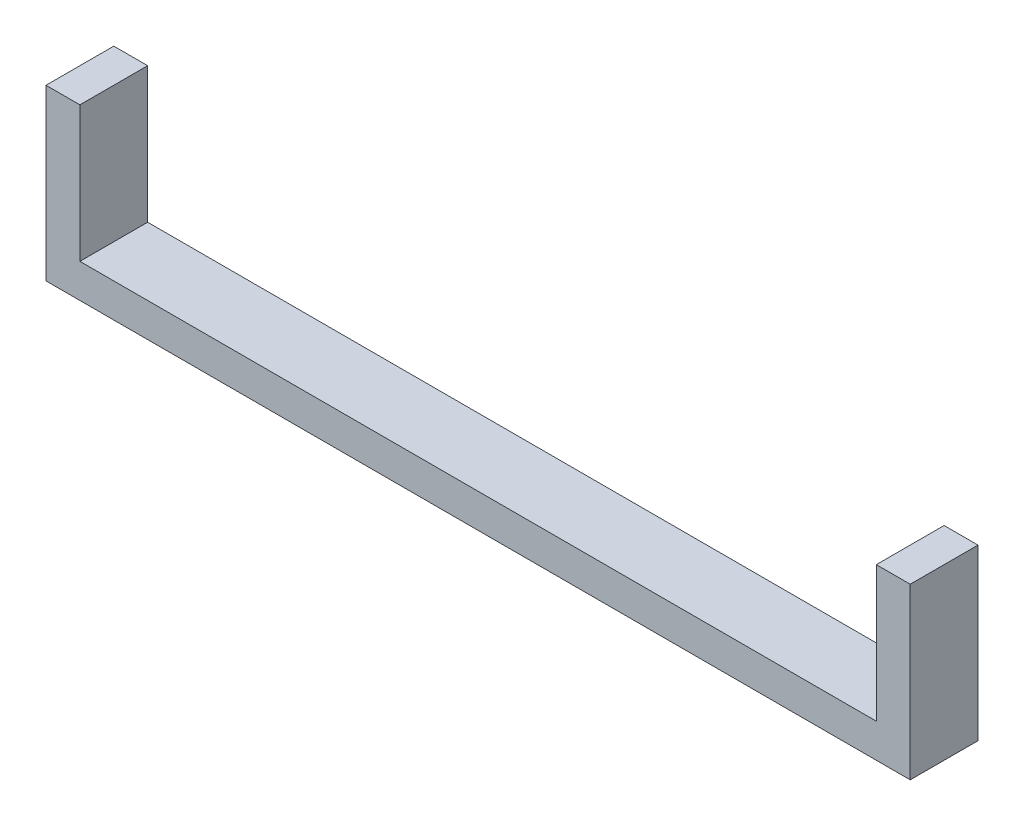
ISO-10303-21;
HEADER;
FILE_DESCRIPTION(('STEP AP214'),'2;1');
FILE_NAME('part.step','',(''),(''),'','','');
FILE_SCHEMA(('AUTOMOTIVE_DESIGN { 1 0 10303 214 1 1 1 1 }'));
ENDSEC;
DATA;
#1=APPLICATION_CONTEXT('core data for automotive mechanical design processes');
#2=APPLICATION_PROTOCOL_DEFINITION('international standard','automotive_design',2000,#1);
#3=PRODUCT_CONTEXT('',#1,'mechanical');
#4=PRODUCT('Part','Part','',(#3));
#5=PRODUCT_RELATED_PRODUCT_CATEGORY('part','',(#4));
#6=PRODUCT_DEFINITION_FORMATION('','',#4);
#7=PRODUCT_DEFINITION_CONTEXT('part definition',#1,'design');
#8=PRODUCT_DEFINITION('design','',#6,#7);
#9=PRODUCT_DEFINITION_SHAPE('','',#8);
#10=(LENGTH_UNIT() NAMED_UNIT(*) SI_UNIT(.MILLI.,.METRE.));
#11=(NAMED_UNIT(*) PLANE_ANGLE_UNIT() SI_UNIT($,.RADIAN.));
#12=(NAMED_UNIT(*) SI_UNIT($,.STERADIAN.) SOLID_ANGLE_UNIT());
#13=UNCERTAINTY_MEASURE_WITH_UNIT(LENGTH_MEASURE(1.E-05),#10,'distance_accuracy_value','');
#14=(GEOMETRIC_REPRESENTATION_CONTEXT(3) GLOBAL_UNCERTAINTY_ASSIGNED_CONTEXT((#13)) GLOBAL_UNIT_ASSIGNED_CONTEXT((#10,
#11,#12)) REPRESENTATION_CONTEXT('',''));
#15=CARTESIAN_POINT('',(0.,0.,0.));
#16=DIRECTION('',(0.,0.,1.));
#17=DIRECTION('',(1.,0.,0.));
#18=AXIS2_PLACEMENT_3D('',#15,#16,#17);
#19=CARTESIAN_POINT('',(0.,63.5,25.4));
#20=DIRECTION('',(1.,0.,0.));
#21=DIRECTION('',(0.,1.,0.));
#22=AXIS2_PLACEMENT_3D('',#19,#20,#21);
#23=PLANE('',#22);
#24=DIRECTION('',(0.,-1.,0.));
#25=VECTOR('',#24,1.);
#26=CARTESIAN_POINT('',(0.,63.5,0.));
#27=LINE('',#26,#25);
#28=CARTESIAN_POINT('',(0.,63.5,0.));
#29=VERTEX_POINT('',#28);
#30=CARTESIAN_POINT('',(0.,0.,0.));
#31=VERTEX_POINT('',#30);
#32=EDGE_CURVE('E140',#29,#31,#27,.T.);
#33=ORIENTED_EDGE('',*,*,#32,.T.);
#34=DIRECTION('',(0.,0.,-1.));
#35=VECTOR('',#34,1.);
#36=CARTESIAN_POINT('',(0.,0.,25.4));
#37=LINE('',#36,#35);
#38=CARTESIAN_POINT('',(0.,0.,25.4));
#39=VERTEX_POINT('',#38);
#40=EDGE_CURVE('E11',#39,#31,#37,.T.);
#41=ORIENTED_EDGE('',*,*,#40,.F.);
#42=DIRECTION('',(0.,-1.,0.));
#43=VECTOR('',#42,1.);
#44=CARTESIAN_POINT('',(0.,63.5,25.4));
#45=LINE('',#44,#43);
#46=CARTESIAN_POINT('',(0.,63.5,25.4));
#47=VERTEX_POINT('',#46);
#48=EDGE_CURVE('E162',#47,#39,#45,.T.);
#49=ORIENTED_EDGE('',*,*,#48,.F.);
#50=DIRECTION('',(0.,0.,-1.));
#51=VECTOR('',#50,1.);
#52=CARTESIAN_POINT('',(0.,63.5,25.4));
#53=LINE('',#52,#51);
#54=EDGE_CURVE('E136',#47,#29,#53,.T.);
#55=ORIENTED_EDGE('',*,*,#54,.T.);
#56=EDGE_LOOP('',(#33,#41,#49,#55));
#57=FACE_BOUND('',#56,.T.);
#58=ADVANCED_FACE('F39',(#57),#23,.F.);
#59=CARTESIAN_POINT('',(0.,0.,25.4));
#60=DIRECTION('',(0.,1.,0.));
#61=DIRECTION('',(0.,0.,1.));
#62=AXIS2_PLACEMENT_3D('',#59,#60,#61);
#63=PLANE('',#62);
#64=DIRECTION('',(1.,0.,0.));
#65=VECTOR('',#64,1.);
#66=CARTESIAN_POINT('',(0.,0.,0.));
#67=LINE('',#66,#65);
#68=CARTESIAN_POINT('',(323.85,0.,0.));
#69=VERTEX_POINT('',#68);
#70=EDGE_CURVE('E144',#31,#69,#67,.T.);
#71=ORIENTED_EDGE('',*,*,#70,.T.);
#72=DIRECTION('',(0.,0.,-1.));
#73=VECTOR('',#72,1.);
#74=CARTESIAN_POINT('',(323.85,0.,25.4));
#75=LINE('',#74,#73);
#76=CARTESIAN_POINT('',(323.85,0.,25.4));
#77=VERTEX_POINT('',#76);
#78=EDGE_CURVE('E48',#77,#69,#75,.T.);
#79=ORIENTED_EDGE('',*,*,#78,.F.);
#80=DIRECTION('',(1.,0.,0.));
#81=VECTOR('',#80,1.);
#82=CARTESIAN_POINT('',(0.,0.,25.4));
#83=LINE('',#82,#81);
#84=EDGE_CURVE('E99',#39,#77,#83,.T.);
#85=ORIENTED_EDGE('',*,*,#84,.F.);
#86=ORIENTED_EDGE('',*,*,#40,.T.);
#87=EDGE_LOOP('',(#71,#79,#85,#86));
#88=FACE_BOUND('',#87,.T.);
#89=ADVANCED_FACE('F208',(#88),#63,.F.);
#90=CARTESIAN_POINT('',(323.85,0.,25.4));
#91=DIRECTION('',(-1.,0.,0.));
#92=DIRECTION('',(0.,0.,1.));
#93=AXIS2_PLACEMENT_3D('',#90,#91,#92);
#94=PLANE('',#93);
#95=DIRECTION('',(0.,1.,0.));
#96=VECTOR('',#95,1.);
#97=CARTESIAN_POINT('',(323.85,0.,0.));
#98=LINE('',#97,#96);
#99=CARTESIAN_POINT('',(323.85,63.5000000000001,0.));
#100=VERTEX_POINT('',#99);
#101=EDGE_CURVE('E147',#69,#100,#98,.T.);
#102=ORIENTED_EDGE('',*,*,#101,.T.);
#103=DIRECTION('',(0.,0.,-1.));
#104=VECTOR('',#103,1.);
#105=CARTESIAN_POINT('',(323.85,63.5000000000001,25.4));
#106=LINE('',#105,#104);
#107=CARTESIAN_POINT('',(323.85,63.5000000000001,25.4));
#108=VERTEX_POINT('',#107);
#109=EDGE_CURVE('E173',#108,#100,#106,.T.);
#110=ORIENTED_EDGE('',*,*,#109,.F.);
#111=DIRECTION('',(0.,1.,0.));
#112=VECTOR('',#111,1.);
#113=CARTESIAN_POINT('',(323.85,0.,25.4));
#114=LINE('',#113,#112);
#115=EDGE_CURVE('E183',#77,#108,#114,.T.);
#116=ORIENTED_EDGE('',*,*,#115,.F.);
#117=ORIENTED_EDGE('',*,*,#78,.T.);
#118=EDGE_LOOP('',(#102,#110,#116,#117));
#119=FACE_BOUND('',#118,.T.);
#120=ADVANCED_FACE('F181',(#119),#94,.F.);
#121=CARTESIAN_POINT('',(323.85,63.5000000000001,25.4));
#122=DIRECTION('',(0.,-1.,0.));
#123=DIRECTION('',(1.,0.,0.));
#124=AXIS2_PLACEMENT_3D('',#121,#122,#123);
#125=PLANE('',#124);
#126=DIRECTION('',(-1.,0.,0.));
#127=VECTOR('',#126,1.);
#128=CARTESIAN_POINT('',(323.85,63.5000000000001,0.));
#129=LINE('',#128,#127);
#130=CARTESIAN_POINT('',(311.15,63.5,0.));
#131=VERTEX_POINT('',#130);
#132=EDGE_CURVE('E150',#100,#131,#129,.T.);
#133=ORIENTED_EDGE('',*,*,#132,.T.);
#134=DIRECTION('',(0.,0.,-1.));
#135=VECTOR('',#134,1.);
#136=CARTESIAN_POINT('',(311.15,63.5,25.4));
#137=LINE('',#136,#135);
#138=CARTESIAN_POINT('',(311.15,63.5,25.4));
#139=VERTEX_POINT('',#138);
#140=EDGE_CURVE('E169',#139,#131,#137,.T.);
#141=ORIENTED_EDGE('',*,*,#140,.F.);
#142=DIRECTION('',(-1.,0.,0.));
#143=VECTOR('',#142,1.);
#144=CARTESIAN_POINT('',(323.85,63.5000000000001,25.4));
#145=LINE('',#144,#143);
#146=EDGE_CURVE('E196',#108,#139,#145,.T.);
#147=ORIENTED_EDGE('',*,*,#146,.F.);
#148=ORIENTED_EDGE('',*,*,#109,.T.);
#149=EDGE_LOOP('',(#133,#141,#147,#148));
#150=FACE_BOUND('',#149,.T.);
#151=ADVANCED_FACE('F191',(#150),#125,.F.);
#152=CARTESIAN_POINT('',(311.15,63.5,25.4));
#153=DIRECTION('',(1.,0.,0.));
#154=DIRECTION('',(0.,0.,-1.));
#155=AXIS2_PLACEMENT_3D('',#152,#153,#154);
#156=PLANE('',#155);
#157=DIRECTION('',(0.,-1.,0.));
#158=VECTOR('',#157,1.);
#159=CARTESIAN_POINT('',(311.15,63.5,0.));
#160=LINE('',#159,#158);
#161=CARTESIAN_POINT('',(311.15,12.7,0.));
#162=VERTEX_POINT('',#161);
#163=EDGE_CURVE('E153',#131,#162,#160,.T.);
#164=ORIENTED_EDGE('',*,*,#163,.T.);
#165=DIRECTION('',(0.,0.,-1.));
#166=VECTOR('',#165,1.);
#167=CARTESIAN_POINT('',(311.15,12.7,25.4));
#168=LINE('',#167,#166);
#169=CARTESIAN_POINT('',(311.15,12.7,25.4));
#170=VERTEX_POINT('',#169);
#171=EDGE_CURVE('E129',#170,#162,#168,.T.);
#172=ORIENTED_EDGE('',*,*,#171,.F.);
#173=DIRECTION('',(0.,-1.,0.));
#174=VECTOR('',#173,1.);
#175=CARTESIAN_POINT('',(311.15,63.5,25.4));
#176=LINE('',#175,#174);
#177=EDGE_CURVE('E118',#139,#170,#176,.T.);
#178=ORIENTED_EDGE('',*,*,#177,.F.);
#179=ORIENTED_EDGE('',*,*,#140,.T.);
#180=EDGE_LOOP('',(#164,#172,#178,#179));
#181=FACE_BOUND('',#180,.T.);
#182=ADVANCED_FACE('F194',(#181),#156,.F.);
#183=CARTESIAN_POINT('',(311.15,12.7,25.4));
#184=DIRECTION('',(0.,-1.,0.));
#185=DIRECTION('',(1.,0.,0.));
#186=AXIS2_PLACEMENT_3D('',#183,#184,#185);
#187=PLANE('',#186);
#188=DIRECTION('',(-1.,0.,0.));
#189=VECTOR('',#188,1.);
#190=CARTESIAN_POINT('',(311.15,12.7,0.));
#191=LINE('',#190,#189);
#192=CARTESIAN_POINT('',(12.7,12.7,0.));
#193=VERTEX_POINT('',#192);
#194=EDGE_CURVE('E127',#162,#193,#191,.T.);
#195=ORIENTED_EDGE('',*,*,#194,.T.);
#196=DIRECTION('',(0.,0.,-1.));
#197=VECTOR('',#196,1.);
#198=CARTESIAN_POINT('',(12.7,12.7,25.4));
#199=LINE('',#198,#197);
#200=CARTESIAN_POINT('',(12.7,12.7,25.4));
#201=VERTEX_POINT('',#200);
#202=EDGE_CURVE('E124',#201,#193,#199,.T.);
#203=ORIENTED_EDGE('',*,*,#202,.F.);
#204=DIRECTION('',(-1.,0.,0.));
#205=VECTOR('',#204,1.);
#206=CARTESIAN_POINT('',(311.15,12.7,25.4));
#207=LINE('',#206,#205);
#208=EDGE_CURVE('E112',#170,#201,#207,.T.);
#209=ORIENTED_EDGE('',*,*,#208,.F.);
#210=ORIENTED_EDGE('',*,*,#171,.T.);
#211=EDGE_LOOP('',(#195,#203,#209,#210));
#212=FACE_BOUND('',#211,.T.);
#213=ADVANCED_FACE('F125',(#212),#187,.F.);
#214=CARTESIAN_POINT('',(12.7,12.7,25.4));
#215=DIRECTION('',(-1.,0.,0.));
#216=DIRECTION('',(0.,0.,1.));
#217=AXIS2_PLACEMENT_3D('',#214,#215,#216);
#218=PLANE('',#217);
#219=DIRECTION('',(0.,1.,0.));
#220=VECTOR('',#219,1.);
#221=CARTESIAN_POINT('',(12.7,12.7,0.));
#222=LINE('',#221,#220);
#223=CARTESIAN_POINT('',(12.7,63.5,0.));
#224=VERTEX_POINT('',#223);
#225=EDGE_CURVE('E85',#193,#224,#222,.T.);
#226=ORIENTED_EDGE('',*,*,#225,.T.);
#227=DIRECTION('',(0.,0.,-1.));
#228=VECTOR('',#227,1.);
#229=CARTESIAN_POINT('',(12.7,63.5,25.4));
#230=LINE('',#229,#228);
#231=CARTESIAN_POINT('',(12.7,63.5,25.4));
#232=VERTEX_POINT('',#231);
#233=EDGE_CURVE('E130',#232,#224,#230,.T.);
#234=ORIENTED_EDGE('',*,*,#233,.F.);
#235=DIRECTION('',(0.,1.,0.));
#236=VECTOR('',#235,1.);
#237=CARTESIAN_POINT('',(12.7,12.7,25.4));
#238=LINE('',#237,#236);
#239=EDGE_CURVE('E116',#201,#232,#238,.T.);
#240=ORIENTED_EDGE('',*,*,#239,.F.);
#241=ORIENTED_EDGE('',*,*,#202,.T.);
#242=EDGE_LOOP('',(#226,#234,#240,#241));
#243=FACE_BOUND('',#242,.T.);
#244=ADVANCED_FACE('F132',(#243),#218,.F.);
#245=CARTESIAN_POINT('',(12.7,63.5,25.4));
#246=DIRECTION('',(0.,-1.,0.));
#247=DIRECTION('',(0.,0.,-1.));
#248=AXIS2_PLACEMENT_3D('',#245,#246,#247);
#249=PLANE('',#248);
#250=DIRECTION('',(-1.,0.,0.));
#251=VECTOR('',#250,1.);
#252=CARTESIAN_POINT('',(12.7,63.5,0.));
#253=LINE('',#252,#251);
#254=EDGE_CURVE('E91',#224,#29,#253,.T.);
#255=ORIENTED_EDGE('',*,*,#254,.T.);
#256=ORIENTED_EDGE('',*,*,#54,.F.);
#257=DIRECTION('',(-1.,0.,0.));
#258=VECTOR('',#257,1.);
#259=CARTESIAN_POINT('',(12.7,63.5,25.4));
#260=LINE('',#259,#258);
#261=EDGE_CURVE('E56',#232,#47,#260,.T.);
#262=ORIENTED_EDGE('',*,*,#261,.F.);
#263=ORIENTED_EDGE('',*,*,#233,.T.);
#264=EDGE_LOOP('',(#255,#256,#262,#263));
#265=FACE_BOUND('',#264,.T.);
#266=ADVANCED_FACE('F224',(#265),#249,.F.);
#267=CARTESIAN_POINT('',(0.,0.,25.4));
#268=DIRECTION('',(0.,0.,1.));
#269=DIRECTION('',(1.,0.,0.));
#270=AXIS2_PLACEMENT_3D('',#267,#268,#269);
#271=PLANE('',#270);
#272=ORIENTED_EDGE('',*,*,#48,.T.);
#273=ORIENTED_EDGE('',*,*,#84,.T.);
#274=ORIENTED_EDGE('',*,*,#115,.T.);
#275=ORIENTED_EDGE('',*,*,#146,.T.);
#276=ORIENTED_EDGE('',*,*,#177,.T.);
#277=ORIENTED_EDGE('',*,*,#208,.T.);
#278=ORIENTED_EDGE('',*,*,#239,.T.);
#279=ORIENTED_EDGE('',*,*,#261,.T.);
#280=EDGE_LOOP('',(#272,#273,#274,#275,#276,#277,#278,#279));
#281=FACE_BOUND('',#280,.T.);
#282=ADVANCED_FACE('F114',(#281),#271,.T.);
#283=CARTESIAN_POINT('',(0.,0.,0.));
#284=DIRECTION('',(0.,0.,1.));
#285=DIRECTION('',(1.,0.,0.));
#286=AXIS2_PLACEMENT_3D('',#283,#284,#285);
#287=PLANE('',#286);
#288=ORIENTED_EDGE('',*,*,#32,.F.);
#289=ORIENTED_EDGE('',*,*,#254,.F.);
#290=ORIENTED_EDGE('',*,*,#225,.F.);
#291=ORIENTED_EDGE('',*,*,#194,.F.);
#292=ORIENTED_EDGE('',*,*,#163,.F.);
#293=ORIENTED_EDGE('',*,*,#132,.F.);
#294=ORIENTED_EDGE('',*,*,#101,.F.);
#295=ORIENTED_EDGE('',*,*,#70,.F.);
#296=EDGE_LOOP('',(#288,#289,#290,#291,#292,#293,#294,#295));
#297=FACE_BOUND('',#296,.T.);
#298=ADVANCED_FACE('F187',(#297),#287,.F.);
#299=CLOSED_SHELL('',(#58,#89,#120,#151,#182,#213,#244,#266,#282,#298));
#300=MANIFOLD_SOLID_BREP('B2',#299);
#301=ADVANCED_BREP_SHAPE_REPRESENTATION('',(#18,#300),#14);
#302=SHAPE_DEFINITION_REPRESENTATION(#9,#301);
ENDSEC;
END-ISO-10303-21;
